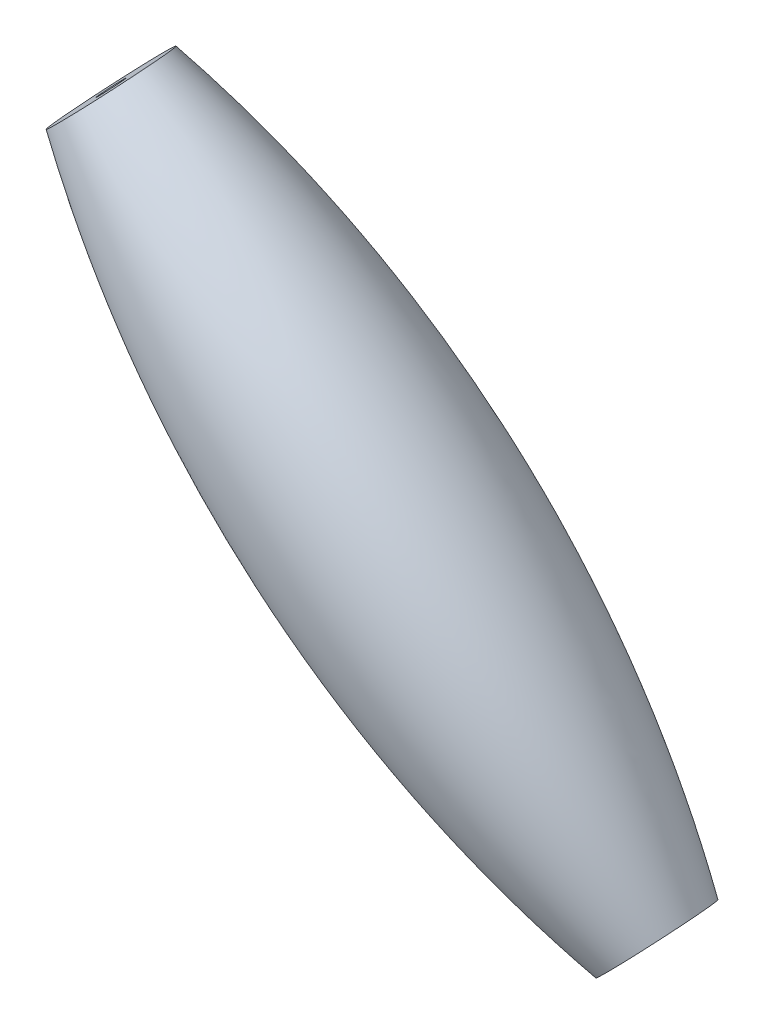
ISO-10303-21;
HEADER;
FILE_DESCRIPTION(('STEP AP214'),'2;1');
FILE_NAME('part.step','',(''),(''),'','','');
FILE_SCHEMA(('AUTOMOTIVE_DESIGN { 1 0 10303 214 1 1 1 1 }'));
ENDSEC;
DATA;
#1=APPLICATION_CONTEXT('core data for automotive mechanical design processes');
#2=APPLICATION_PROTOCOL_DEFINITION('international standard','automotive_design',2000,#1);
#3=PRODUCT_CONTEXT('',#1,'mechanical');
#4=PRODUCT('Part','Part','',(#3));
#5=PRODUCT_RELATED_PRODUCT_CATEGORY('part','',(#4));
#6=PRODUCT_DEFINITION_FORMATION('','',#4);
#7=PRODUCT_DEFINITION_CONTEXT('part definition',#1,'design');
#8=PRODUCT_DEFINITION('design','',#6,#7);
#9=PRODUCT_DEFINITION_SHAPE('','',#8);
#10=(LENGTH_UNIT() NAMED_UNIT(*) SI_UNIT(.MILLI.,.METRE.));
#11=(NAMED_UNIT(*) PLANE_ANGLE_UNIT() SI_UNIT($,.RADIAN.));
#12=(NAMED_UNIT(*) SI_UNIT($,.STERADIAN.) SOLID_ANGLE_UNIT());
#13=UNCERTAINTY_MEASURE_WITH_UNIT(LENGTH_MEASURE(1.E-05),#10,'distance_accuracy_value','');
#14=(GEOMETRIC_REPRESENTATION_CONTEXT(3) GLOBAL_UNCERTAINTY_ASSIGNED_CONTEXT((#13)) GLOBAL_UNIT_ASSIGNED_CONTEXT((#10,
#11,#12)) REPRESENTATION_CONTEXT('',''));
#15=CARTESIAN_POINT('',(0.,0.,0.));
#16=DIRECTION('',(0.,0.,1.));
#17=DIRECTION('',(1.,0.,0.));
#18=AXIS2_PLACEMENT_3D('',#15,#16,#17);
#19=CARTESIAN_POINT('',(54.7360681123358,-22.0645228367134,-60.6217782649106));
#20=DIRECTION('',(0.707106781186551,-0.704890677037012,-0.0559386577091165));
#21=DIRECTION('',(0.70599612051437,0.708215700065071,0.));
#22=AXIS2_PLACEMENT_3D('',#19,#20,#21);
#23=PLANE('',#22);
#24=CARTESIAN_POINT('',(54.7360681123358,-22.0645228367134,-60.6217782649106));
#25=DIRECTION('',(0.707106781186551,-0.704890677037012,-0.0559386577091165));
#26=DIRECTION('',(0.70599612051437,0.708215700065071,0.));
#27=AXIS2_PLACEMENT_3D('',#24,#25,#26);
#28=CIRCLE('',#27,1.38599999999999);
#29=CARTESIAN_POINT('',(55.7145787353687,-21.0829358764232,-60.6217782649106));
#30=VERTEX_POINT('',#29);
#31=EDGE_CURVE('E58',#30,#30,#28,.T.);
#32=ORIENTED_EDGE('',*,*,#31,.F.);
#33=EDGE_LOOP('',(#32));
#34=FACE_BOUND('',#33,.T.);
#35=CARTESIAN_POINT('',(54.7360681123358,-22.0645228367134,-60.6217782649106));
#36=DIRECTION('',(0.707106781186551,-0.704890677037012,-0.0559386577091165));
#37=DIRECTION('',(0.70599612051437,0.708215700065071,0.));
#38=AXIS2_PLACEMENT_3D('',#35,#36,#37);
#39=CIRCLE('',#38,5.55431325664738);
#40=CARTESIAN_POINT('',(58.6573917236504,-18.1308709852761,-60.6217782649106));
#41=VERTEX_POINT('',#40);
#42=EDGE_CURVE('E49',#41,#41,#39,.T.);
#43=ORIENTED_EDGE('',*,*,#42,.T.);
#44=EDGE_LOOP('',(#43));
#45=FACE_BOUND('',#44,.T.);
#46=ADVANCED_FACE('F41',(#34,#45),#23,.T.);
#47=CARTESIAN_POINT('',(0.,32.4999999999999,-56.2916512459886));
#48=DIRECTION('',(-0.707106781186551,0.704890677037012,0.0559386577091165));
#49=DIRECTION('',(-0.70599612051437,-0.708215700065071,0.));
#50=AXIS2_PLACEMENT_3D('',#47,#48,#49);
#51=PLANE('',#50);
#52=CARTESIAN_POINT('',(0.,32.4999999999999,-56.2916512459886));
#53=DIRECTION('',(-0.707106781186551,0.704890677037012,0.0559386577091165));
#54=DIRECTION('',(-0.70599612051437,-0.708215700065071,0.));
#55=AXIS2_PLACEMENT_3D('',#52,#53,#54);
#56=CIRCLE('',#55,1.38599999999999);
#57=CARTESIAN_POINT('',(-0.978510623032911,31.5184130397097,-56.2916512459886));
#58=VERTEX_POINT('',#57);
#59=EDGE_CURVE('E44',#58,#58,#56,.T.);
#60=ORIENTED_EDGE('',*,*,#59,.F.);
#61=EDGE_LOOP('',(#60));
#62=FACE_BOUND('',#61,.T.);
#63=CARTESIAN_POINT('',(0.,32.4999999999999,-56.2916512459886));
#64=DIRECTION('',(0.707106781186551,-0.704890677037012,-0.0559386577091165));
#65=DIRECTION('',(0.70599612051437,0.708215700065071,0.));
#66=AXIS2_PLACEMENT_3D('',#63,#64,#65);
#67=CIRCLE('',#66,5.90417663046323);
#68=CARTESIAN_POINT('',(4.16832579593864,36.6814305856512,-56.2916512459886));
#69=VERTEX_POINT('',#68);
#70=EDGE_CURVE('E10',#69,#69,#67,.T.);
#71=ORIENTED_EDGE('',*,*,#70,.F.);
#72=EDGE_LOOP('',(#71));
#73=FACE_BOUND('',#72,.T.);
#74=ADVANCED_FACE('F64',(#62,#73),#51,.T.);
#75=CARTESIAN_POINT('',(26.3984713006035,0.,0.));
#76=DIRECTION('',(0.706984057103755,0.703294513699205,0.0745008053762719));
#77=DIRECTION('',(0.70703655960283,-0.705319031938119,-0.0512285718214833));
#78=AXIS2_PLACEMENT_3D('',#75,#76,#77);
#79=ELLIPSE('',#78,98.98,70.);
#80=TRIMMED_CURVE('',#79,(PARAMETER_VALUE(1.00123407612061)),
(PARAMETER_VALUE(2.15373505820665)),.T.,.PARAMETER.);
#81=CARTESIAN_POINT('',(54.7360681123358,-22.0645228367134,-60.6217782649106));
#82=DIRECTION('',(0.707106781186551,-0.704890677037012,-0.0559386577091165));
#83=AXIS1_PLACEMENT('',#81,#82);
#84=SURFACE_OF_REVOLUTION('',#80,#83);
#85=ORIENTED_EDGE('',*,*,#70,.T.);
#86=EDGE_LOOP('',(#85));
#87=FACE_BOUND('',#86,.T.);
#88=ORIENTED_EDGE('',*,*,#42,.F.);
#89=EDGE_LOOP('',(#88));
#90=FACE_BOUND('',#89,.T.);
#91=ADVANCED_FACE('F60',(#87,#90),#84,.F.);
#92=CARTESIAN_POINT('',(-8.9035421944538,41.3756380966177,-55.5872990710901));
#93=DIRECTION('',(0.707106781186551,-0.704890677037012,-0.0559386577091165));
#94=DIRECTION('',(0.70599612051437,0.708215700065071,0.));
#95=AXIS2_PLACEMENT_3D('',#92,#93,#94);
#96=CYLINDRICAL_SURFACE('',#95,1.38599999999999);
#97=ORIENTED_EDGE('',*,*,#59,.T.);
#98=EDGE_LOOP('',(#97));
#99=FACE_BOUND('',#98,.T.);
#100=ORIENTED_EDGE('',*,*,#31,.T.);
#101=EDGE_LOOP('',(#100));
#102=FACE_BOUND('',#101,.T.);
#103=ADVANCED_FACE('F63',(#99,#102),#96,.F.);
#104=CLOSED_SHELL('',(#46,#74,#91,#103));
#105=MANIFOLD_SOLID_BREP('B2',#104);
#106=ADVANCED_BREP_SHAPE_REPRESENTATION('',(#18,#105),#14);
#107=SHAPE_DEFINITION_REPRESENTATION(#9,#106);
ENDSEC;
END-ISO-10303-21;
